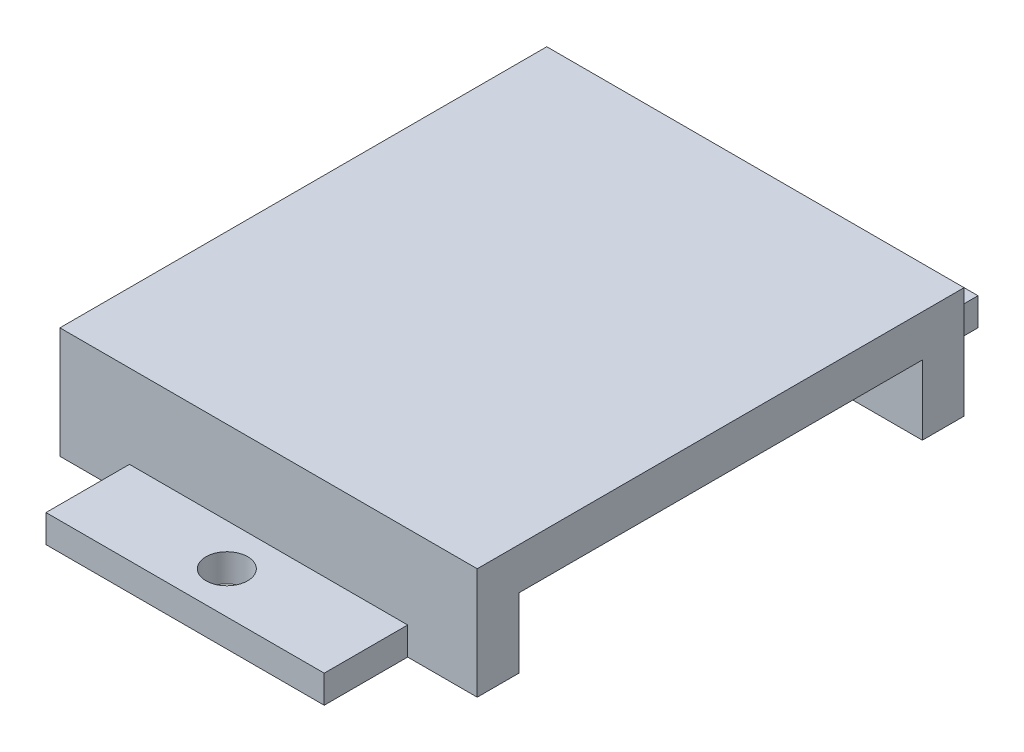
ISO-10303-21;
HEADER;
FILE_DESCRIPTION(('STEP AP214'),'2;1');
FILE_NAME('part.step','',(''),(''),'','','');
FILE_SCHEMA(('AUTOMOTIVE_DESIGN { 1 0 10303 214 1 1 1 1 }'));
ENDSEC;
DATA;
#1=APPLICATION_CONTEXT('core data for automotive mechanical design processes');
#2=APPLICATION_PROTOCOL_DEFINITION('international standard','automotive_design',2000,#1);
#3=PRODUCT_CONTEXT('',#1,'mechanical');
#4=PRODUCT('Part','Part','',(#3));
#5=PRODUCT_RELATED_PRODUCT_CATEGORY('part','',(#4));
#6=PRODUCT_DEFINITION_FORMATION('','',#4);
#7=PRODUCT_DEFINITION_CONTEXT('part definition',#1,'design');
#8=PRODUCT_DEFINITION('design','',#6,#7);
#9=PRODUCT_DEFINITION_SHAPE('','',#8);
#10=(LENGTH_UNIT() NAMED_UNIT(*) SI_UNIT(.MILLI.,.METRE.));
#11=(NAMED_UNIT(*) PLANE_ANGLE_UNIT() SI_UNIT($,.RADIAN.));
#12=(NAMED_UNIT(*) SI_UNIT($,.STERADIAN.) SOLID_ANGLE_UNIT());
#13=UNCERTAINTY_MEASURE_WITH_UNIT(LENGTH_MEASURE(1.E-05),#10,'distance_accuracy_value','');
#14=(GEOMETRIC_REPRESENTATION_CONTEXT(3) GLOBAL_UNCERTAINTY_ASSIGNED_CONTEXT((#13)) GLOBAL_UNIT_ASSIGNED_CONTEXT((#10,
#11,#12)) REPRESENTATION_CONTEXT('',''));
#15=CARTESIAN_POINT('',(0.,0.,0.));
#16=DIRECTION('',(0.,0.,1.));
#17=DIRECTION('',(1.,0.,0.));
#18=AXIS2_PLACEMENT_3D('',#15,#16,#17);
#19=CARTESIAN_POINT('',(0.,8.,-35.));
#20=DIRECTION('',(0.,0.,1.));
#21=DIRECTION('',(1.,0.,0.));
#22=AXIS2_PLACEMENT_3D('',#19,#20,#21);
#23=PLANE('',#22);
#24=DIRECTION('',(0.,-1.,0.));
#25=VECTOR('',#24,1.);
#26=CARTESIAN_POINT('',(-5.,0.,-35.));
#27=LINE('',#26,#25);
#28=CARTESIAN_POINT('',(-5.,2.,-35.));
#29=VERTEX_POINT('',#28);
#30=CARTESIAN_POINT('',(-5.,0.,-35.));
#31=VERTEX_POINT('',#30);
#32=EDGE_CURVE('E62',#29,#31,#27,.T.);
#33=ORIENTED_EDGE('',*,*,#32,.F.);
#34=DIRECTION('',(1.,0.,0.));
#35=VECTOR('',#34,1.);
#36=CARTESIAN_POINT('',(-5.,2.,-35.));
#37=LINE('',#36,#35);
#38=CARTESIAN_POINT('',(-25.,2.,-35.));
#39=VERTEX_POINT('',#38);
#40=EDGE_CURVE('E182',#39,#29,#37,.T.);
#41=ORIENTED_EDGE('',*,*,#40,.F.);
#42=DIRECTION('',(0.,1.,0.));
#43=VECTOR('',#42,1.);
#44=CARTESIAN_POINT('',(-25.,0.,-35.));
#45=LINE('',#44,#43);
#46=CARTESIAN_POINT('',(-25.,0.,-35.));
#47=VERTEX_POINT('',#46);
#48=EDGE_CURVE('E68',#47,#39,#45,.T.);
#49=ORIENTED_EDGE('',*,*,#48,.F.);
#50=DIRECTION('',(-1.,0.,0.));
#51=VECTOR('',#50,1.);
#52=CARTESIAN_POINT('',(0.,0.,-35.));
#53=LINE('',#52,#51);
#54=CARTESIAN_POINT('',(-30.,0.,-35.));
#55=VERTEX_POINT('',#54);
#56=EDGE_CURVE('E278',#47,#55,#53,.T.);
#57=ORIENTED_EDGE('',*,*,#56,.T.);
#58=DIRECTION('',(0.,-1.,0.));
#59=VECTOR('',#58,1.);
#60=CARTESIAN_POINT('',(-30.,8.,-35.));
#61=LINE('',#60,#59);
#62=CARTESIAN_POINT('',(-30.,8.,-35.));
#63=VERTEX_POINT('',#62);
#64=EDGE_CURVE('E297',#63,#55,#61,.T.);
#65=ORIENTED_EDGE('',*,*,#64,.F.);
#66=DIRECTION('',(-1.,0.,0.));
#67=VECTOR('',#66,1.);
#68=CARTESIAN_POINT('',(0.,8.,-35.));
#69=LINE('',#68,#67);
#70=CARTESIAN_POINT('',(0.,8.,-35.));
#71=VERTEX_POINT('',#70);
#72=EDGE_CURVE('E263',#71,#63,#69,.T.);
#73=ORIENTED_EDGE('',*,*,#72,.F.);
#74=DIRECTION('',(0.,-1.,0.));
#75=VECTOR('',#74,1.);
#76=CARTESIAN_POINT('',(0.,8.,-35.));
#77=LINE('',#76,#75);
#78=CARTESIAN_POINT('',(0.,0.,-35.));
#79=VERTEX_POINT('',#78);
#80=EDGE_CURVE('E301',#71,#79,#77,.T.);
#81=ORIENTED_EDGE('',*,*,#80,.T.);
#82=EDGE_CURVE('E279',#79,#31,#53,.T.);
#83=ORIENTED_EDGE('',*,*,#82,.T.);
#84=EDGE_LOOP('',(#33,#41,#49,#57,#65,#73,#81,#83));
#85=FACE_BOUND('',#84,.T.);
#86=ADVANCED_FACE('F45',(#85),#23,.F.);
#87=CARTESIAN_POINT('',(0.,8.,0.));
#88=DIRECTION('',(0.,0.,-1.));
#89=DIRECTION('',(-1.,0.,0.));
#90=AXIS2_PLACEMENT_3D('',#87,#88,#89);
#91=PLANE('',#90);
#92=DIRECTION('',(0.,-1.,0.));
#93=VECTOR('',#92,1.);
#94=CARTESIAN_POINT('',(-25.,0.,0.));
#95=LINE('',#94,#93);
#96=CARTESIAN_POINT('',(-25.,2.,0.));
#97=VERTEX_POINT('',#96);
#98=CARTESIAN_POINT('',(-25.,0.,0.));
#99=VERTEX_POINT('',#98);
#100=EDGE_CURVE('E186',#97,#99,#95,.T.);
#101=ORIENTED_EDGE('',*,*,#100,.F.);
#102=DIRECTION('',(-1.,0.,0.));
#103=VECTOR('',#102,1.);
#104=CARTESIAN_POINT('',(-25.,2.,0.));
#105=LINE('',#104,#103);
#106=CARTESIAN_POINT('',(-5.,2.,0.));
#107=VERTEX_POINT('',#106);
#108=EDGE_CURVE('E202',#107,#97,#105,.T.);
#109=ORIENTED_EDGE('',*,*,#108,.F.);
#110=DIRECTION('',(0.,1.,0.));
#111=VECTOR('',#110,1.);
#112=CARTESIAN_POINT('',(-5.,0.,0.));
#113=LINE('',#112,#111);
#114=CARTESIAN_POINT('',(-5.,0.,0.));
#115=VERTEX_POINT('',#114);
#116=EDGE_CURVE('E191',#115,#107,#113,.T.);
#117=ORIENTED_EDGE('',*,*,#116,.F.);
#118=DIRECTION('',(1.,0.,0.));
#119=VECTOR('',#118,1.);
#120=CARTESIAN_POINT('',(0.,0.,0.));
#121=LINE('',#120,#119);
#122=CARTESIAN_POINT('',(0.,0.,0.));
#123=VERTEX_POINT('',#122);
#124=EDGE_CURVE('E287',#115,#123,#121,.T.);
#125=ORIENTED_EDGE('',*,*,#124,.T.);
#126=DIRECTION('',(0.,-1.,0.));
#127=VECTOR('',#126,1.);
#128=CARTESIAN_POINT('',(0.,8.,0.));
#129=LINE('',#128,#127);
#130=CARTESIAN_POINT('',(0.,8.,0.));
#131=VERTEX_POINT('',#130);
#132=EDGE_CURVE('E273',#131,#123,#129,.T.);
#133=ORIENTED_EDGE('',*,*,#132,.F.);
#134=DIRECTION('',(1.,0.,0.));
#135=VECTOR('',#134,1.);
#136=CARTESIAN_POINT('',(0.,8.,0.));
#137=LINE('',#136,#135);
#138=CARTESIAN_POINT('',(-30.,8.,0.));
#139=VERTEX_POINT('',#138);
#140=EDGE_CURVE('E270',#139,#131,#137,.T.);
#141=ORIENTED_EDGE('',*,*,#140,.F.);
#142=DIRECTION('',(0.,-1.,0.));
#143=VECTOR('',#142,1.);
#144=CARTESIAN_POINT('',(-30.,8.,0.));
#145=LINE('',#144,#143);
#146=CARTESIAN_POINT('',(-30.,0.,0.));
#147=VERTEX_POINT('',#146);
#148=EDGE_CURVE('E293',#139,#147,#145,.T.);
#149=ORIENTED_EDGE('',*,*,#148,.T.);
#150=EDGE_CURVE('E264',#147,#99,#121,.T.);
#151=ORIENTED_EDGE('',*,*,#150,.T.);
#152=EDGE_LOOP('',(#101,#109,#117,#125,#133,#141,#149,#151));
#153=FACE_BOUND('',#152,.T.);
#154=ADVANCED_FACE('F326',(#153),#91,.F.);
#155=CARTESIAN_POINT('',(0.,0.,0.));
#156=DIRECTION('',(0.,1.,0.));
#157=DIRECTION('',(0.,0.,1.));
#158=AXIS2_PLACEMENT_3D('',#155,#156,#157);
#159=PLANE('',#158);
#160=CARTESIAN_POINT('',(-15.,0.,3.));
#161=DIRECTION('',(0.,-1.,0.));
#162=DIRECTION('',(0.,0.,-1.));
#163=AXIS2_PLACEMENT_3D('',#160,#161,#162);
#164=CIRCLE('',#163,1.49999999999999);
#165=CARTESIAN_POINT('',(-15.,0.,1.50000000000001));
#166=VERTEX_POINT('',#165);
#167=EDGE_CURVE('E557',#166,#166,#164,.T.);
#168=ORIENTED_EDGE('',*,*,#167,.F.);
#169=EDGE_LOOP('',(#168));
#170=FACE_BOUND('',#169,.T.);
#171=DIRECTION('',(0.,0.,1.));
#172=VECTOR('',#171,1.);
#173=CARTESIAN_POINT('',(-30.,0.,0.));
#174=LINE('',#173,#172);
#175=CARTESIAN_POINT('',(-30.,0.,-3.));
#176=VERTEX_POINT('',#175);
#177=EDGE_CURVE('E282',#176,#147,#174,.T.);
#178=ORIENTED_EDGE('',*,*,#177,.F.);
#179=DIRECTION('',(1.,0.,0.));
#180=VECTOR('',#179,1.);
#181=CARTESIAN_POINT('',(0.,0.,-3.));
#182=LINE('',#181,#180);
#183=CARTESIAN_POINT('',(0.,0.,-3.));
#184=VERTEX_POINT('',#183);
#185=EDGE_CURVE('E55',#176,#184,#182,.T.);
#186=ORIENTED_EDGE('',*,*,#185,.T.);
#187=DIRECTION('',(0.,0.,-1.));
#188=VECTOR('',#187,1.);
#189=CARTESIAN_POINT('',(0.,0.,0.));
#190=LINE('',#189,#188);
#191=EDGE_CURVE('E274',#123,#184,#190,.T.);
#192=ORIENTED_EDGE('',*,*,#191,.F.);
#193=ORIENTED_EDGE('',*,*,#124,.F.);
#194=DIRECTION('',(0.,0.,-1.));
#195=VECTOR('',#194,1.);
#196=CARTESIAN_POINT('',(-5.,0.,6.));
#197=LINE('',#196,#195);
#198=CARTESIAN_POINT('',(-5.,0.,6.));
#199=VERTEX_POINT('',#198);
#200=EDGE_CURVE('E225',#199,#115,#197,.T.);
#201=ORIENTED_EDGE('',*,*,#200,.F.);
#202=DIRECTION('',(1.,0.,0.));
#203=VECTOR('',#202,1.);
#204=CARTESIAN_POINT('',(-25.,0.,6.));
#205=LINE('',#204,#203);
#206=CARTESIAN_POINT('',(-25.,0.,6.));
#207=VERTEX_POINT('',#206);
#208=EDGE_CURVE('E201',#207,#199,#205,.T.);
#209=ORIENTED_EDGE('',*,*,#208,.F.);
#210=DIRECTION('',(0.,0.,-1.));
#211=VECTOR('',#210,1.);
#212=CARTESIAN_POINT('',(-25.,0.,6.));
#213=LINE('',#212,#211);
#214=EDGE_CURVE('E229',#207,#99,#213,.T.);
#215=ORIENTED_EDGE('',*,*,#214,.T.);
#216=ORIENTED_EDGE('',*,*,#150,.F.);
#217=EDGE_LOOP('',(#178,#186,#192,#193,#201,#209,#215,#216));
#218=FACE_BOUND('',#217,.T.);
#219=ADVANCED_FACE('F314',(#170,#218),#159,.F.);
#220=CARTESIAN_POINT('',(0.,8.,0.));
#221=DIRECTION('',(-1.,0.,0.));
#222=DIRECTION('',(0.,0.,1.));
#223=AXIS2_PLACEMENT_3D('',#220,#221,#222);
#224=PLANE('',#223);
#225=ORIENTED_EDGE('',*,*,#191,.T.);
#226=DIRECTION('',(0.,-1.,0.));
#227=VECTOR('',#226,1.);
#228=CARTESIAN_POINT('',(0.,0.,-3.));
#229=LINE('',#228,#227);
#230=CARTESIAN_POINT('',(0.,5.,-3.));
#231=VERTEX_POINT('',#230);
#232=EDGE_CURVE('E233',#231,#184,#229,.T.);
#233=ORIENTED_EDGE('',*,*,#232,.F.);
#234=DIRECTION('',(0.,0.,1.));
#235=VECTOR('',#234,1.);
#236=CARTESIAN_POINT('',(0.,5.,-3.));
#237=LINE('',#236,#235);
#238=CARTESIAN_POINT('',(0.,5.,-32.));
#239=VERTEX_POINT('',#238);
#240=EDGE_CURVE('E240',#239,#231,#237,.T.);
#241=ORIENTED_EDGE('',*,*,#240,.F.);
#242=DIRECTION('',(0.,1.,0.));
#243=VECTOR('',#242,1.);
#244=CARTESIAN_POINT('',(0.,0.,-32.));
#245=LINE('',#244,#243);
#246=CARTESIAN_POINT('',(0.,0.,-32.));
#247=VERTEX_POINT('',#246);
#248=EDGE_CURVE('E236',#247,#239,#245,.T.);
#249=ORIENTED_EDGE('',*,*,#248,.F.);
#250=EDGE_CURVE('E258',#247,#79,#190,.T.);
#251=ORIENTED_EDGE('',*,*,#250,.T.);
#252=ORIENTED_EDGE('',*,*,#80,.F.);
#253=DIRECTION('',(0.,0.,-1.));
#254=VECTOR('',#253,1.);
#255=CARTESIAN_POINT('',(0.,8.,0.));
#256=LINE('',#255,#254);
#257=EDGE_CURVE('E259',#131,#71,#256,.T.);
#258=ORIENTED_EDGE('',*,*,#257,.F.);
#259=ORIENTED_EDGE('',*,*,#132,.T.);
#260=EDGE_LOOP('',(#225,#233,#241,#249,#251,#252,#258,#259));
#261=FACE_BOUND('',#260,.T.);
#262=ADVANCED_FACE('F47',(#261),#224,.F.);
#263=CARTESIAN_POINT('',(-30.,8.,0.));
#264=DIRECTION('',(1.,0.,0.));
#265=DIRECTION('',(0.,0.,-1.));
#266=AXIS2_PLACEMENT_3D('',#263,#264,#265);
#267=PLANE('',#266);
#268=DIRECTION('',(0.,0.,1.));
#269=VECTOR('',#268,1.);
#270=CARTESIAN_POINT('',(-30.,5.,0.));
#271=LINE('',#270,#269);
#272=CARTESIAN_POINT('',(-30.,5.,-32.));
#273=VERTEX_POINT('',#272);
#274=CARTESIAN_POINT('',(-30.,5.,-3.));
#275=VERTEX_POINT('',#274);
#276=EDGE_CURVE('E11',#273,#275,#271,.T.);
#277=ORIENTED_EDGE('',*,*,#276,.T.);
#278=DIRECTION('',(0.,-1.,0.));
#279=VECTOR('',#278,1.);
#280=CARTESIAN_POINT('',(-30.,8.,-3.));
#281=LINE('',#280,#279);
#282=EDGE_CURVE('E254',#275,#176,#281,.T.);
#283=ORIENTED_EDGE('',*,*,#282,.T.);
#284=ORIENTED_EDGE('',*,*,#177,.T.);
#285=ORIENTED_EDGE('',*,*,#148,.F.);
#286=DIRECTION('',(0.,0.,1.));
#287=VECTOR('',#286,1.);
#288=CARTESIAN_POINT('',(-30.,8.,0.));
#289=LINE('',#288,#287);
#290=EDGE_CURVE('E267',#63,#139,#289,.T.);
#291=ORIENTED_EDGE('',*,*,#290,.F.);
#292=ORIENTED_EDGE('',*,*,#64,.T.);
#293=CARTESIAN_POINT('',(-30.,0.,-32.));
#294=VERTEX_POINT('',#293);
#295=EDGE_CURVE('E283',#55,#294,#174,.T.);
#296=ORIENTED_EDGE('',*,*,#295,.T.);
#297=DIRECTION('',(0.,1.,0.));
#298=VECTOR('',#297,1.);
#299=CARTESIAN_POINT('',(-30.,8.00000000000004,-32.));
#300=LINE('',#299,#298);
#301=EDGE_CURVE('E248',#294,#273,#300,.T.);
#302=ORIENTED_EDGE('',*,*,#301,.T.);
#303=EDGE_LOOP('',(#277,#283,#284,#285,#291,#292,#296,#302));
#304=FACE_BOUND('',#303,.T.);
#305=ADVANCED_FACE('F339',(#304),#267,.F.);
#306=CARTESIAN_POINT('',(0.,8.,0.));
#307=DIRECTION('',(0.,1.,0.));
#308=DIRECTION('',(0.,0.,1.));
#309=AXIS2_PLACEMENT_3D('',#306,#307,#308);
#310=PLANE('',#309);
#311=ORIENTED_EDGE('',*,*,#257,.T.);
#312=ORIENTED_EDGE('',*,*,#72,.T.);
#313=ORIENTED_EDGE('',*,*,#290,.T.);
#314=ORIENTED_EDGE('',*,*,#140,.T.);
#315=EDGE_LOOP('',(#311,#312,#313,#314));
#316=FACE_BOUND('',#315,.T.);
#317=ADVANCED_FACE('F336',(#316),#310,.T.);
#318=CARTESIAN_POINT('',(-15.,0.,-38.));
#319=DIRECTION('',(0.,-1.,0.));
#320=DIRECTION('',(0.,0.,-1.));
#321=AXIS2_PLACEMENT_3D('',#318,#319,#320);
#322=CIRCLE('',#321,1.49999999999999);
#323=CARTESIAN_POINT('',(-15.,0.,-39.5));
#324=VERTEX_POINT('',#323);
#325=EDGE_CURVE('E553',#324,#324,#322,.T.);
#326=ORIENTED_EDGE('',*,*,#325,.F.);
#327=EDGE_LOOP('',(#326));
#328=FACE_BOUND('',#327,.T.);
#329=ORIENTED_EDGE('',*,*,#250,.F.);
#330=DIRECTION('',(-1.,0.,0.));
#331=VECTOR('',#330,1.);
#332=CARTESIAN_POINT('',(0.,0.,-32.));
#333=LINE('',#332,#331);
#334=EDGE_CURVE('E305',#247,#294,#333,.T.);
#335=ORIENTED_EDGE('',*,*,#334,.T.);
#336=ORIENTED_EDGE('',*,*,#295,.F.);
#337=ORIENTED_EDGE('',*,*,#56,.F.);
#338=DIRECTION('',(0.,0.,1.));
#339=VECTOR('',#338,1.);
#340=CARTESIAN_POINT('',(-25.,0.,-41.));
#341=LINE('',#340,#339);
#342=CARTESIAN_POINT('',(-25.,0.,-41.));
#343=VERTEX_POINT('',#342);
#344=EDGE_CURVE('E167',#343,#47,#341,.T.);
#345=ORIENTED_EDGE('',*,*,#344,.F.);
#346=DIRECTION('',(-1.,0.,0.));
#347=VECTOR('',#346,1.);
#348=CARTESIAN_POINT('',(-5.,0.,-41.));
#349=LINE('',#348,#347);
#350=CARTESIAN_POINT('',(-5.,0.,-41.));
#351=VERTEX_POINT('',#350);
#352=EDGE_CURVE('E159',#351,#343,#349,.T.);
#353=ORIENTED_EDGE('',*,*,#352,.F.);
#354=DIRECTION('',(0.,0.,1.));
#355=VECTOR('',#354,1.);
#356=CARTESIAN_POINT('',(-5.,0.,-41.));
#357=LINE('',#356,#355);
#358=EDGE_CURVE('E165',#351,#31,#357,.T.);
#359=ORIENTED_EDGE('',*,*,#358,.T.);
#360=ORIENTED_EDGE('',*,*,#82,.F.);
#361=EDGE_LOOP('',(#329,#335,#336,#337,#345,#353,#359,#360));
#362=FACE_BOUND('',#361,.T.);
#363=ADVANCED_FACE('F162',(#328,#362),#159,.F.);
#364=CARTESIAN_POINT('',(-68.,5.,-3.));
#365=DIRECTION('',(0.,1.,0.));
#366=DIRECTION('',(0.,0.,1.));
#367=AXIS2_PLACEMENT_3D('',#364,#365,#366);
#368=PLANE('',#367);
#369=DIRECTION('',(1.,0.,0.));
#370=VECTOR('',#369,1.);
#371=CARTESIAN_POINT('',(-68.,5.,-32.));
#372=LINE('',#371,#370);
#373=EDGE_CURVE('E244',#273,#239,#372,.T.);
#374=ORIENTED_EDGE('',*,*,#373,.T.);
#375=ORIENTED_EDGE('',*,*,#240,.T.);
#376=DIRECTION('',(1.,0.,0.));
#377=VECTOR('',#376,1.);
#378=CARTESIAN_POINT('',(-68.,5.,-3.));
#379=LINE('',#378,#377);
#380=EDGE_CURVE('E245',#275,#231,#379,.T.);
#381=ORIENTED_EDGE('',*,*,#380,.F.);
#382=ORIENTED_EDGE('',*,*,#276,.F.);
#383=EDGE_LOOP('',(#374,#375,#381,#382));
#384=FACE_BOUND('',#383,.T.);
#385=ADVANCED_FACE('F375',(#384),#368,.F.);
#386=CARTESIAN_POINT('',(-68.,0.,-3.));
#387=DIRECTION('',(0.,0.,1.));
#388=DIRECTION('',(1.,0.,0.));
#389=AXIS2_PLACEMENT_3D('',#386,#387,#388);
#390=PLANE('',#389);
#391=ORIENTED_EDGE('',*,*,#380,.T.);
#392=ORIENTED_EDGE('',*,*,#232,.T.);
#393=ORIENTED_EDGE('',*,*,#185,.F.);
#394=ORIENTED_EDGE('',*,*,#282,.F.);
#395=EDGE_LOOP('',(#391,#392,#393,#394));
#396=FACE_BOUND('',#395,.T.);
#397=ADVANCED_FACE('F379',(#396),#390,.F.);
#398=CARTESIAN_POINT('',(-68.,0.,-32.));
#399=DIRECTION('',(0.,0.,-1.));
#400=DIRECTION('',(0.,1.,0.));
#401=AXIS2_PLACEMENT_3D('',#398,#399,#400);
#402=PLANE('',#401);
#403=ORIENTED_EDGE('',*,*,#334,.F.);
#404=ORIENTED_EDGE('',*,*,#248,.T.);
#405=ORIENTED_EDGE('',*,*,#373,.F.);
#406=ORIENTED_EDGE('',*,*,#301,.F.);
#407=EDGE_LOOP('',(#403,#404,#405,#406));
#408=FACE_BOUND('',#407,.T.);
#409=ADVANCED_FACE('F382',(#408),#402,.F.);
#410=CARTESIAN_POINT('',(-25.,0.,6.));
#411=DIRECTION('',(1.,0.,0.));
#412=DIRECTION('',(0.,0.,-1.));
#413=AXIS2_PLACEMENT_3D('',#410,#411,#412);
#414=PLANE('',#413);
#415=ORIENTED_EDGE('',*,*,#100,.T.);
#416=ORIENTED_EDGE('',*,*,#214,.F.);
#417=DIRECTION('',(0.,-1.,0.));
#418=VECTOR('',#417,1.);
#419=CARTESIAN_POINT('',(-25.,0.,6.));
#420=LINE('',#419,#418);
#421=CARTESIAN_POINT('',(-25.,2.,6.));
#422=VERTEX_POINT('',#421);
#423=EDGE_CURVE('E197',#422,#207,#420,.T.);
#424=ORIENTED_EDGE('',*,*,#423,.F.);
#425=DIRECTION('',(0.,0.,-1.));
#426=VECTOR('',#425,1.);
#427=CARTESIAN_POINT('',(-25.,2.,6.));
#428=LINE('',#427,#426);
#429=EDGE_CURVE('E210',#422,#97,#428,.T.);
#430=ORIENTED_EDGE('',*,*,#429,.T.);
#431=EDGE_LOOP('',(#415,#416,#424,#430));
#432=FACE_BOUND('',#431,.T.);
#433=ADVANCED_FACE('F343',(#432),#414,.F.);
#434=CARTESIAN_POINT('',(-5.,0.,6.));
#435=DIRECTION('',(-1.,0.,0.));
#436=DIRECTION('',(0.,0.,1.));
#437=AXIS2_PLACEMENT_3D('',#434,#435,#436);
#438=PLANE('',#437);
#439=ORIENTED_EDGE('',*,*,#116,.T.);
#440=DIRECTION('',(0.,0.,-1.));
#441=VECTOR('',#440,1.);
#442=CARTESIAN_POINT('',(-5.,2.,6.));
#443=LINE('',#442,#441);
#444=CARTESIAN_POINT('',(-5.,2.,6.));
#445=VERTEX_POINT('',#444);
#446=EDGE_CURVE('E221',#445,#107,#443,.T.);
#447=ORIENTED_EDGE('',*,*,#446,.F.);
#448=DIRECTION('',(0.,1.,0.));
#449=VECTOR('',#448,1.);
#450=CARTESIAN_POINT('',(-5.,0.,6.));
#451=LINE('',#450,#449);
#452=EDGE_CURVE('E205',#199,#445,#451,.T.);
#453=ORIENTED_EDGE('',*,*,#452,.F.);
#454=ORIENTED_EDGE('',*,*,#200,.T.);
#455=EDGE_LOOP('',(#439,#447,#453,#454));
#456=FACE_BOUND('',#455,.T.);
#457=ADVANCED_FACE('F351',(#456),#438,.F.);
#458=CARTESIAN_POINT('',(-25.,2.,6.));
#459=DIRECTION('',(0.,-1.,0.));
#460=DIRECTION('',(0.,0.,-1.));
#461=AXIS2_PLACEMENT_3D('',#458,#459,#460);
#462=PLANE('',#461);
#463=CARTESIAN_POINT('',(-15.,2.,3.));
#464=DIRECTION('',(0.,-1.,0.));
#465=DIRECTION('',(0.,0.,-1.));
#466=AXIS2_PLACEMENT_3D('',#463,#464,#465);
#467=CIRCLE('',#466,1.49999999999999);
#468=CARTESIAN_POINT('',(-15.,2.,1.50000000000001));
#469=VERTEX_POINT('',#468);
#470=EDGE_CURVE('E49',#469,#469,#467,.T.);
#471=ORIENTED_EDGE('',*,*,#470,.T.);
#472=EDGE_LOOP('',(#471));
#473=FACE_BOUND('',#472,.T.);
#474=ORIENTED_EDGE('',*,*,#108,.T.);
#475=ORIENTED_EDGE('',*,*,#429,.F.);
#476=DIRECTION('',(-1.,0.,0.));
#477=VECTOR('',#476,1.);
#478=CARTESIAN_POINT('',(-25.,2.,6.));
#479=LINE('',#478,#477);
#480=EDGE_CURVE('E208',#445,#422,#479,.T.);
#481=ORIENTED_EDGE('',*,*,#480,.F.);
#482=ORIENTED_EDGE('',*,*,#446,.T.);
#483=EDGE_LOOP('',(#474,#475,#481,#482));
#484=FACE_BOUND('',#483,.T.);
#485=ADVANCED_FACE('F346',(#473,#484),#462,.F.);
#486=CARTESIAN_POINT('',(0.,0.,6.));
#487=DIRECTION('',(0.,0.,-1.));
#488=DIRECTION('',(-1.,0.,0.));
#489=AXIS2_PLACEMENT_3D('',#486,#487,#488);
#490=PLANE('',#489);
#491=ORIENTED_EDGE('',*,*,#423,.T.);
#492=ORIENTED_EDGE('',*,*,#208,.T.);
#493=ORIENTED_EDGE('',*,*,#452,.T.);
#494=ORIENTED_EDGE('',*,*,#480,.T.);
#495=EDGE_LOOP('',(#491,#492,#493,#494));
#496=FACE_BOUND('',#495,.T.);
#497=ADVANCED_FACE('F353',(#496),#490,.F.);
#498=CARTESIAN_POINT('',(-5.,0.,-41.));
#499=DIRECTION('',(-1.,0.,0.));
#500=DIRECTION('',(0.,0.,1.));
#501=AXIS2_PLACEMENT_3D('',#498,#499,#500);
#502=PLANE('',#501);
#503=ORIENTED_EDGE('',*,*,#32,.T.);
#504=ORIENTED_EDGE('',*,*,#358,.F.);
#505=DIRECTION('',(0.,-1.,0.));
#506=VECTOR('',#505,1.);
#507=CARTESIAN_POINT('',(-5.,0.,-41.));
#508=LINE('',#507,#506);
#509=CARTESIAN_POINT('',(-5.,2.,-41.));
#510=VERTEX_POINT('',#509);
#511=EDGE_CURVE('E172',#510,#351,#508,.T.);
#512=ORIENTED_EDGE('',*,*,#511,.F.);
#513=DIRECTION('',(0.,0.,1.));
#514=VECTOR('',#513,1.);
#515=CARTESIAN_POINT('',(-5.,2.,-41.));
#516=LINE('',#515,#514);
#517=EDGE_CURVE('E537',#510,#29,#516,.T.);
#518=ORIENTED_EDGE('',*,*,#517,.T.);
#519=EDGE_LOOP('',(#503,#504,#512,#518));
#520=FACE_BOUND('',#519,.T.);
#521=ADVANCED_FACE('F184',(#520),#502,.F.);
#522=CARTESIAN_POINT('',(-25.,0.,-41.));
#523=DIRECTION('',(1.,0.,0.));
#524=DIRECTION('',(0.,0.,-1.));
#525=AXIS2_PLACEMENT_3D('',#522,#523,#524);
#526=PLANE('',#525);
#527=ORIENTED_EDGE('',*,*,#48,.T.);
#528=DIRECTION('',(0.,0.,1.));
#529=VECTOR('',#528,1.);
#530=CARTESIAN_POINT('',(-25.,2.,-41.));
#531=LINE('',#530,#529);
#532=CARTESIAN_POINT('',(-25.,2.,-41.));
#533=VERTEX_POINT('',#532);
#534=EDGE_CURVE('E193',#533,#39,#531,.T.);
#535=ORIENTED_EDGE('',*,*,#534,.F.);
#536=DIRECTION('',(0.,1.,0.));
#537=VECTOR('',#536,1.);
#538=CARTESIAN_POINT('',(-25.,0.,-41.));
#539=LINE('',#538,#537);
#540=EDGE_CURVE('E171',#343,#533,#539,.T.);
#541=ORIENTED_EDGE('',*,*,#540,.F.);
#542=ORIENTED_EDGE('',*,*,#344,.T.);
#543=EDGE_LOOP('',(#527,#535,#541,#542));
#544=FACE_BOUND('',#543,.T.);
#545=ADVANCED_FACE('F361',(#544),#526,.F.);
#546=CARTESIAN_POINT('',(-5.,2.,-41.));
#547=DIRECTION('',(0.,-1.,0.));
#548=DIRECTION('',(0.,0.,-1.));
#549=AXIS2_PLACEMENT_3D('',#546,#547,#548);
#550=PLANE('',#549);
#551=CARTESIAN_POINT('',(-15.,2.,-38.));
#552=DIRECTION('',(0.,-1.,0.));
#553=DIRECTION('',(0.,0.,-1.));
#554=AXIS2_PLACEMENT_3D('',#551,#552,#553);
#555=CIRCLE('',#554,1.49999999999999);
#556=CARTESIAN_POINT('',(-15.,2.,-39.5));
#557=VERTEX_POINT('',#556);
#558=EDGE_CURVE('E545',#557,#557,#555,.T.);
#559=ORIENTED_EDGE('',*,*,#558,.T.);
#560=EDGE_LOOP('',(#559));
#561=FACE_BOUND('',#560,.T.);
#562=ORIENTED_EDGE('',*,*,#40,.T.);
#563=ORIENTED_EDGE('',*,*,#517,.F.);
#564=DIRECTION('',(1.,0.,0.));
#565=VECTOR('',#564,1.);
#566=CARTESIAN_POINT('',(-5.,2.,-41.));
#567=LINE('',#566,#565);
#568=EDGE_CURVE('E177',#533,#510,#567,.T.);
#569=ORIENTED_EDGE('',*,*,#568,.F.);
#570=ORIENTED_EDGE('',*,*,#534,.T.);
#571=EDGE_LOOP('',(#562,#563,#569,#570));
#572=FACE_BOUND('',#571,.T.);
#573=ADVANCED_FACE('F474',(#561,#572),#550,.F.);
#574=CARTESIAN_POINT('',(0.,0.,-41.));
#575=DIRECTION('',(0.,0.,1.));
#576=DIRECTION('',(1.,0.,0.));
#577=AXIS2_PLACEMENT_3D('',#574,#575,#576);
#578=PLANE('',#577);
#579=ORIENTED_EDGE('',*,*,#511,.T.);
#580=ORIENTED_EDGE('',*,*,#352,.T.);
#581=ORIENTED_EDGE('',*,*,#540,.T.);
#582=ORIENTED_EDGE('',*,*,#568,.T.);
#583=EDGE_LOOP('',(#579,#580,#581,#582));
#584=FACE_BOUND('',#583,.T.);
#585=ADVANCED_FACE('F175',(#584),#578,.F.);
#586=CARTESIAN_POINT('',(-15.,0.,-38.));
#587=DIRECTION('',(0.,-1.,0.));
#588=DIRECTION('',(0.,0.,-1.));
#589=AXIS2_PLACEMENT_3D('',#586,#587,#588);
#590=CYLINDRICAL_SURFACE('',#589,1.49999999999999);
#591=ORIENTED_EDGE('',*,*,#325,.T.);
#592=EDGE_LOOP('',(#591));
#593=FACE_BOUND('',#592,.T.);
#594=ORIENTED_EDGE('',*,*,#558,.F.);
#595=EDGE_LOOP('',(#594));
#596=FACE_BOUND('',#595,.T.);
#597=ADVANCED_FACE('F484',(#593,#596),#590,.F.);
#598=CARTESIAN_POINT('',(-15.,0.,3.));
#599=DIRECTION('',(0.,-1.,0.));
#600=DIRECTION('',(0.,0.,-1.));
#601=AXIS2_PLACEMENT_3D('',#598,#599,#600);
#602=CYLINDRICAL_SURFACE('',#601,1.49999999999999);
#603=ORIENTED_EDGE('',*,*,#167,.T.);
#604=EDGE_LOOP('',(#603));
#605=FACE_BOUND('',#604,.T.);
#606=ORIENTED_EDGE('',*,*,#470,.F.);
#607=EDGE_LOOP('',(#606));
#608=FACE_BOUND('',#607,.T.);
#609=ADVANCED_FACE('F488',(#605,#608),#602,.F.);
#610=CLOSED_SHELL('',(#86,#154,#219,#262,#305,#317,#363,#385,#397,#409,#433,#457,#485,#497,#521,
#545,#573,#585,#597,#609));
#611=MANIFOLD_SOLID_BREP('B2',#610);
#612=ADVANCED_BREP_SHAPE_REPRESENTATION('',(#18,#611),#14);
#613=SHAPE_DEFINITION_REPRESENTATION(#9,#612);
ENDSEC;
END-ISO-10303-21;
